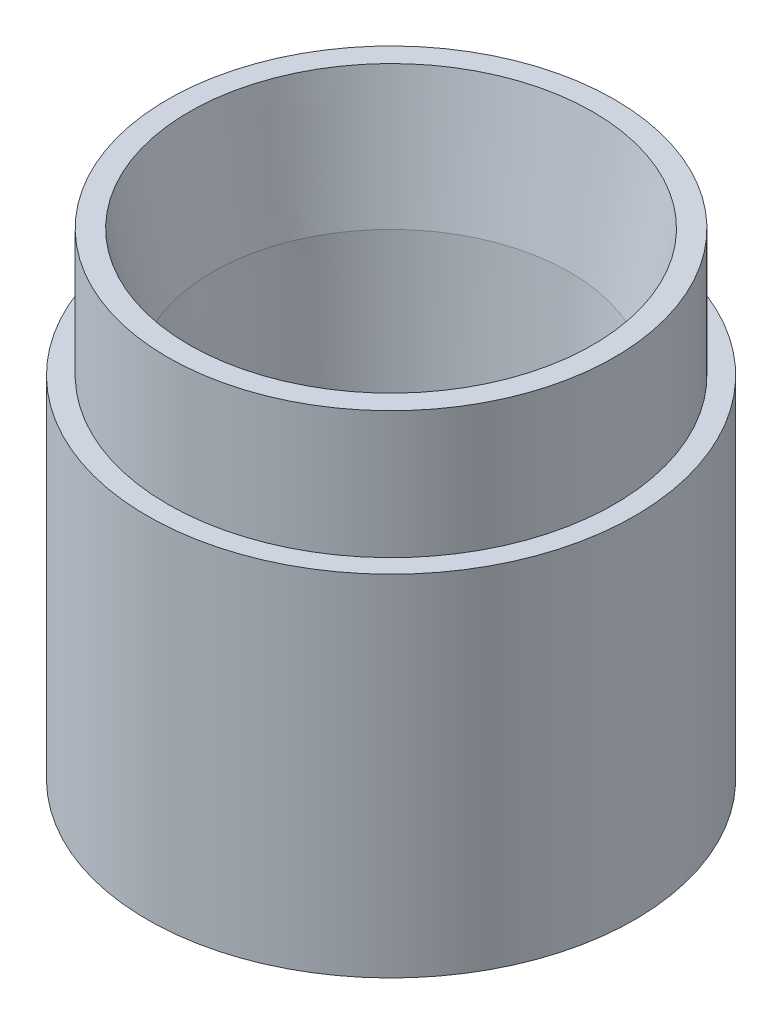
ISO-10303-21;
HEADER;
FILE_DESCRIPTION(('STEP AP214'),'2;1');
FILE_NAME('part.step','',(''),(''),'','','');
FILE_SCHEMA(('AUTOMOTIVE_DESIGN { 1 0 10303 214 1 1 1 1 }'));
ENDSEC;
DATA;
#1=APPLICATION_CONTEXT('core data for automotive mechanical design processes');
#2=APPLICATION_PROTOCOL_DEFINITION('international standard','automotive_design',2000,#1);
#3=PRODUCT_CONTEXT('',#1,'mechanical');
#4=PRODUCT('Part','Part','',(#3));
#5=PRODUCT_RELATED_PRODUCT_CATEGORY('part','',(#4));
#6=PRODUCT_DEFINITION_FORMATION('','',#4);
#7=PRODUCT_DEFINITION_CONTEXT('part definition',#1,'design');
#8=PRODUCT_DEFINITION('design','',#6,#7);
#9=PRODUCT_DEFINITION_SHAPE('','',#8);
#10=(LENGTH_UNIT() NAMED_UNIT(*) SI_UNIT(.MILLI.,.METRE.));
#11=(NAMED_UNIT(*) PLANE_ANGLE_UNIT() SI_UNIT($,.RADIAN.));
#12=(NAMED_UNIT(*) SI_UNIT($,.STERADIAN.) SOLID_ANGLE_UNIT());
#13=UNCERTAINTY_MEASURE_WITH_UNIT(LENGTH_MEASURE(1.E-05),#10,'distance_accuracy_value','');
#14=(GEOMETRIC_REPRESENTATION_CONTEXT(3) GLOBAL_UNCERTAINTY_ASSIGNED_CONTEXT((#13)) GLOBAL_UNIT_ASSIGNED_CONTEXT((#10,
#11,#12)) REPRESENTATION_CONTEXT('',''));
#15=CARTESIAN_POINT('',(0.,0.,0.));
#16=DIRECTION('',(0.,0.,1.));
#17=DIRECTION('',(1.,0.,0.));
#18=AXIS2_PLACEMENT_3D('',#15,#16,#17);
#19=CARTESIAN_POINT('',(0.,-117.74922299812,0.));
#20=DIRECTION('',(0.,-1.,0.));
#21=DIRECTION('',(0.,0.,-1.));
#22=AXIS2_PLACEMENT_3D('',#19,#20,#21);
#23=CYLINDRICAL_SURFACE('',#22,49.53);
#24=CARTESIAN_POINT('',(0.,-109.340308374392,0.));
#25=DIRECTION('',(0.,-1.,0.));
#26=DIRECTION('',(0.,0.,-1.));
#27=AXIS2_PLACEMENT_3D('',#24,#25,#26);
#28=CIRCLE('',#27,49.53);
#29=CARTESIAN_POINT('',(0.,-109.340308374392,-49.53));
#30=VERTEX_POINT('',#29);
#31=EDGE_CURVE('E76',#30,#30,#28,.T.);
#32=ORIENTED_EDGE('',*,*,#31,.T.);
#33=EDGE_LOOP('',(#32));
#34=FACE_BOUND('',#33,.T.);
#35=CARTESIAN_POINT('',(0.,-90.2903083743924,0.));
#36=DIRECTION('',(0.,-1.,0.));
#37=DIRECTION('',(0.,0.,-1.));
#38=AXIS2_PLACEMENT_3D('',#35,#36,#37);
#39=CIRCLE('',#38,49.53);
#40=CARTESIAN_POINT('',(0.,-90.2903083743924,-49.53));
#41=VERTEX_POINT('',#40);
#42=EDGE_CURVE('E10',#41,#41,#39,.T.);
#43=ORIENTED_EDGE('',*,*,#42,.F.);
#44=EDGE_LOOP('',(#43));
#45=FACE_BOUND('',#44,.T.);
#46=ADVANCED_FACE('F41',(#34,#45),#23,.F.);
#47=CARTESIAN_POINT('',(0.,0.,0.));
#48=DIRECTION('',(0.,1.,0.));
#49=DIRECTION('',(0.,0.,1.));
#50=AXIS2_PLACEMENT_3D('',#47,#48,#49);
#51=CONICAL_SURFACE('',#50,55.88,0.0702130912407799);
#52=ORIENTED_EDGE('',*,*,#42,.T.);
#53=EDGE_LOOP('',(#52));
#54=FACE_BOUND('',#53,.T.);
#55=CARTESIAN_POINT('',(0.,0.,0.));
#56=DIRECTION('',(0.,-1.,0.));
#57=DIRECTION('',(0.,0.,-1.));
#58=AXIS2_PLACEMENT_3D('',#55,#56,#57);
#59=CIRCLE('',#58,55.88);
#60=CARTESIAN_POINT('',(0.,0.,-55.88));
#61=VERTEX_POINT('',#60);
#62=EDGE_CURVE('E48',#61,#61,#59,.T.);
#63=ORIENTED_EDGE('',*,*,#62,.F.);
#64=EDGE_LOOP('',(#63));
#65=FACE_BOUND('',#64,.T.);
#66=ADVANCED_FACE('F115',(#54,#65),#51,.F.);
#67=CARTESIAN_POINT('',(0.,0.,0.));
#68=DIRECTION('',(0.,1.,0.));
#69=DIRECTION('',(0.,0.,1.));
#70=AXIS2_PLACEMENT_3D('',#67,#68,#69);
#71=CONICAL_SURFACE('',#70,55.88,0.18000570171156);
#72=CARTESIAN_POINT('',(0.,39.7879841001668,0.));
#73=DIRECTION('',(0.,-1.,0.));
#74=DIRECTION('',(0.,0.,-1.));
#75=AXIS2_PLACEMENT_3D('',#72,#73,#74);
#76=CIRCLE('',#75,63.1204351);
#77=CARTESIAN_POINT('',(0.,39.7879841001668,-63.1204351));
#78=VERTEX_POINT('',#77);
#79=EDGE_CURVE('E53',#78,#78,#76,.T.);
#80=ORIENTED_EDGE('',*,*,#79,.F.);
#81=EDGE_LOOP('',(#80));
#82=FACE_BOUND('',#81,.T.);
#83=ORIENTED_EDGE('',*,*,#62,.T.);
#84=EDGE_LOOP('',(#83));
#85=FACE_BOUND('',#84,.T.);
#86=ADVANCED_FACE('F109',(#82,#85),#71,.F.);
#87=CARTESIAN_POINT('',(0.,39.7879841001668,0.));
#88=DIRECTION('',(0.,1.,0.));
#89=DIRECTION('',(0.,0.,1.));
#90=AXIS2_PLACEMENT_3D('',#87,#88,#89);
#91=PLANE('',#90);
#92=ORIENTED_EDGE('',*,*,#79,.T.);
#93=EDGE_LOOP('',(#92));
#94=FACE_BOUND('',#93,.T.);
#95=CARTESIAN_POINT('',(0.,39.7879841001668,0.));
#96=DIRECTION('',(0.,-1.,0.));
#97=DIRECTION('',(0.,0.,-1.));
#98=AXIS2_PLACEMENT_3D('',#95,#96,#97);
#99=CIRCLE('',#98,69.85);
#100=CARTESIAN_POINT('',(0.,39.7879841001668,-69.85));
#101=VERTEX_POINT('',#100);
#102=EDGE_CURVE('E58',#101,#101,#99,.T.);
#103=ORIENTED_EDGE('',*,*,#102,.F.);
#104=EDGE_LOOP('',(#103));
#105=FACE_BOUND('',#104,.T.);
#106=ADVANCED_FACE('F104',(#94,#105),#91,.T.);
#107=CARTESIAN_POINT('',(0.,-117.74922299812,0.));
#108=DIRECTION('',(0.,-1.,0.));
#109=DIRECTION('',(0.,0.,-1.));
#110=AXIS2_PLACEMENT_3D('',#107,#108,#109);
#111=CYLINDRICAL_SURFACE('',#110,69.85);
#112=CARTESIAN_POINT('',(0.,0.,0.));
#113=DIRECTION('',(0.,-1.,0.));
#114=DIRECTION('',(0.,0.,-1.));
#115=AXIS2_PLACEMENT_3D('',#112,#113,#114);
#116=CIRCLE('',#115,69.85);
#117=CARTESIAN_POINT('',(0.,0.,-69.85));
#118=VERTEX_POINT('',#117);
#119=EDGE_CURVE('E64',#118,#118,#116,.T.);
#120=ORIENTED_EDGE('',*,*,#119,.F.);
#121=EDGE_LOOP('',(#120));
#122=FACE_BOUND('',#121,.T.);
#123=ORIENTED_EDGE('',*,*,#102,.T.);
#124=EDGE_LOOP('',(#123));
#125=FACE_BOUND('',#124,.T.);
#126=ADVANCED_FACE('F98',(#122,#125),#111,.T.);
#127=CARTESIAN_POINT('',(0.,0.,0.));
#128=DIRECTION('',(0.,-1.,0.));
#129=DIRECTION('',(0.,0.,-1.));
#130=AXIS2_PLACEMENT_3D('',#127,#128,#129);
#131=PLANE('',#130);
#132=CARTESIAN_POINT('',(0.,0.,0.));
#133=DIRECTION('',(0.,-1.,0.));
#134=DIRECTION('',(0.,0.,-1.));
#135=AXIS2_PLACEMENT_3D('',#132,#133,#134);
#136=CIRCLE('',#135,76.2);
#137=CARTESIAN_POINT('',(0.,0.,-76.2));
#138=VERTEX_POINT('',#137);
#139=EDGE_CURVE('E68',#138,#138,#136,.T.);
#140=ORIENTED_EDGE('',*,*,#139,.F.);
#141=EDGE_LOOP('',(#140));
#142=FACE_BOUND('',#141,.T.);
#143=ORIENTED_EDGE('',*,*,#119,.T.);
#144=EDGE_LOOP('',(#143));
#145=FACE_BOUND('',#144,.T.);
#146=ADVANCED_FACE('F92',(#142,#145),#131,.F.);
#147=CARTESIAN_POINT('',(0.,-117.74922299812,0.));
#148=DIRECTION('',(0.,-1.,0.));
#149=DIRECTION('',(0.,0.,-1.));
#150=AXIS2_PLACEMENT_3D('',#147,#148,#149);
#151=CYLINDRICAL_SURFACE('',#150,76.2);
#152=CARTESIAN_POINT('',(0.,-109.340308374392,0.));
#153=DIRECTION('',(0.,-1.,0.));
#154=DIRECTION('',(0.,0.,-1.));
#155=AXIS2_PLACEMENT_3D('',#152,#153,#154);
#156=CIRCLE('',#155,76.2);
#157=CARTESIAN_POINT('',(0.,-109.340308374392,-76.2));
#158=VERTEX_POINT('',#157);
#159=EDGE_CURVE('E72',#158,#158,#156,.T.);
#160=ORIENTED_EDGE('',*,*,#159,.F.);
#161=EDGE_LOOP('',(#160));
#162=FACE_BOUND('',#161,.T.);
#163=ORIENTED_EDGE('',*,*,#139,.T.);
#164=EDGE_LOOP('',(#163));
#165=FACE_BOUND('',#164,.T.);
#166=ADVANCED_FACE('F86',(#162,#165),#151,.T.);
#167=CARTESIAN_POINT('',(5.51448188417012E-13,-109.340308374392,0.));
#168=DIRECTION('',(0.,1.,0.));
#169=DIRECTION('',(0.,0.,1.));
#170=AXIS2_PLACEMENT_3D('',#167,#168,#169);
#171=PLANE('',#170);
#172=ORIENTED_EDGE('',*,*,#31,.F.);
#173=EDGE_LOOP('',(#172));
#174=FACE_BOUND('',#173,.T.);
#175=ORIENTED_EDGE('',*,*,#159,.T.);
#176=EDGE_LOOP('',(#175));
#177=FACE_BOUND('',#176,.T.);
#178=ADVANCED_FACE('F83',(#174,#177),#171,.F.);
#179=CLOSED_SHELL('',(#46,#66,#86,#106,#126,#146,#166,#178));
#180=MANIFOLD_SOLID_BREP('B2',#179);
#181=ADVANCED_BREP_SHAPE_REPRESENTATION('',(#18,#180),#14);
#182=SHAPE_DEFINITION_REPRESENTATION(#9,#181);
ENDSEC;
END-ISO-10303-21;
